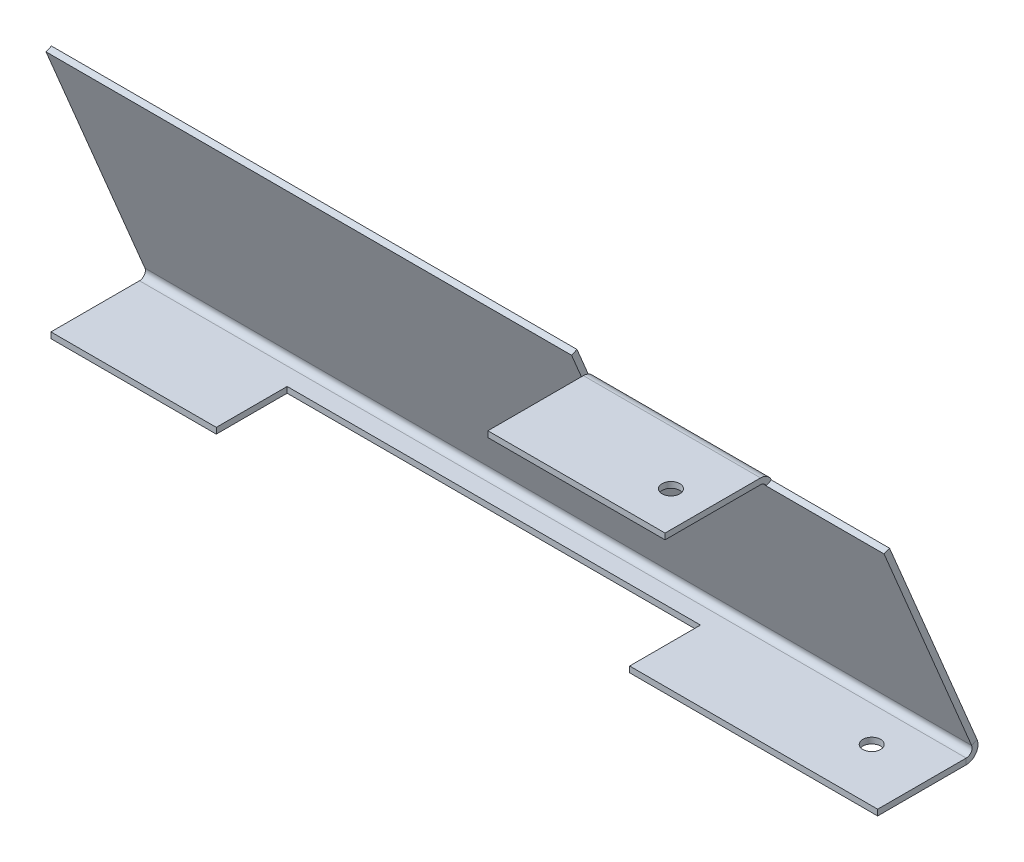
ISO-10303-21;
HEADER;
FILE_DESCRIPTION(('STEP AP214'),'2;1');
FILE_NAME('part.step','',(''),(''),'','','');
FILE_SCHEMA(('AUTOMOTIVE_DESIGN { 1 0 10303 214 1 1 1 1 }'));
ENDSEC;
DATA;
#1=APPLICATION_CONTEXT('core data for automotive mechanical design processes');
#2=APPLICATION_PROTOCOL_DEFINITION('international standard','automotive_design',2000,#1);
#3=PRODUCT_CONTEXT('',#1,'mechanical');
#4=PRODUCT('Part','Part','',(#3));
#5=PRODUCT_RELATED_PRODUCT_CATEGORY('part','',(#4));
#6=PRODUCT_DEFINITION_FORMATION('','',#4);
#7=PRODUCT_DEFINITION_CONTEXT('part definition',#1,'design');
#8=PRODUCT_DEFINITION('design','',#6,#7);
#9=PRODUCT_DEFINITION_SHAPE('','',#8);
#10=(LENGTH_UNIT() NAMED_UNIT(*) SI_UNIT(.MILLI.,.METRE.));
#11=(NAMED_UNIT(*) PLANE_ANGLE_UNIT() SI_UNIT($,.RADIAN.));
#12=(NAMED_UNIT(*) SI_UNIT($,.STERADIAN.) SOLID_ANGLE_UNIT());
#13=UNCERTAINTY_MEASURE_WITH_UNIT(LENGTH_MEASURE(1.E-05),#10,'distance_accuracy_value','');
#14=(GEOMETRIC_REPRESENTATION_CONTEXT(3) GLOBAL_UNCERTAINTY_ASSIGNED_CONTEXT((#13)) GLOBAL_UNIT_ASSIGNED_CONTEXT((#10,
#11,#12)) REPRESENTATION_CONTEXT('',''));
#15=CARTESIAN_POINT('',(0.,0.,0.));
#16=DIRECTION('',(0.,0.,1.));
#17=DIRECTION('',(1.,0.,0.));
#18=AXIS2_PLACEMENT_3D('',#15,#16,#17);
#19=CARTESIAN_POINT('',(-50.,26.1783925873606,26.9352779162392));
#20=DIRECTION('',(1.,0.,0.));
#21=DIRECTION('',(0.,0.,-1.));
#22=AXIS2_PLACEMENT_3D('',#19,#20,#21);
#23=PLANE('',#22);
#24=DIRECTION('',(0.,0.,-1.));
#25=VECTOR('',#24,1.);
#26=CARTESIAN_POINT('',(-50.,39.5,-1.5));
#27=LINE('',#26,#25);
#28=CARTESIAN_POINT('',(-50.,39.5,16.));
#29=VERTEX_POINT('',#28);
#30=CARTESIAN_POINT('',(-50.,39.5,-0.167964071594525));
#31=VERTEX_POINT('',#30);
#32=EDGE_CURVE('E237',#29,#31,#27,.T.);
#33=ORIENTED_EDGE('',*,*,#32,.T.);
#34=DIRECTION('',(0.,-1.,0.));
#35=VECTOR('',#34,1.);
#36=CARTESIAN_POINT('',(-50.,39.5,-0.167964071594525));
#37=LINE('',#36,#35);
#38=CARTESIAN_POINT('',(-50.,38.5,-0.167964071594525));
#39=VERTEX_POINT('',#38);
#40=EDGE_CURVE('E12',#31,#39,#37,.T.);
#41=ORIENTED_EDGE('',*,*,#40,.T.);
#42=DIRECTION('',(0.,0.,-1.));
#43=VECTOR('',#42,1.);
#44=CARTESIAN_POINT('',(-50.,38.5,-1.5));
#45=LINE('',#44,#43);
#46=CARTESIAN_POINT('',(-50.,38.5,16.));
#47=VERTEX_POINT('',#46);
#48=EDGE_CURVE('E62',#47,#39,#45,.T.);
#49=ORIENTED_EDGE('',*,*,#48,.F.);
#50=DIRECTION('',(0.,-1.,0.));
#51=VECTOR('',#50,1.);
#52=CARTESIAN_POINT('',(-50.,38.5,16.));
#53=LINE('',#52,#51);
#54=EDGE_CURVE('E48',#29,#47,#53,.T.);
#55=ORIENTED_EDGE('',*,*,#54,.F.);
#56=EDGE_LOOP('',(#33,#41,#49,#55));
#57=FACE_BOUND('',#56,.T.);
#58=ADVANCED_FACE('F40',(#57),#23,.F.);
#59=CARTESIAN_POINT('',(-140.,0.,0.));
#60=DIRECTION('',(0.,0.,-1.));
#61=DIRECTION('',(-1.,0.,0.));
#62=AXIS2_PLACEMENT_3D('',#59,#60,#61);
#63=PLANE('',#62);
#64=DIRECTION('',(1.,0.,0.));
#65=VECTOR('',#64,1.);
#66=CARTESIAN_POINT('',(-140.,1.,0.));
#67=LINE('',#66,#65);
#68=CARTESIAN_POINT('',(-42.,1.,0.));
#69=VERTEX_POINT('',#68);
#70=CARTESIAN_POINT('',(0.,1.,0.));
#71=VERTEX_POINT('',#70);
#72=EDGE_CURVE('E323',#69,#71,#67,.T.);
#73=ORIENTED_EDGE('',*,*,#72,.F.);
#74=DIRECTION('',(0.,-1.,0.));
#75=VECTOR('',#74,1.);
#76=CARTESIAN_POINT('',(-42.,1.,0.));
#77=LINE('',#76,#75);
#78=CARTESIAN_POINT('',(-42.,0.,0.));
#79=VERTEX_POINT('',#78);
#80=EDGE_CURVE('E254',#69,#79,#77,.T.);
#81=ORIENTED_EDGE('',*,*,#80,.T.);
#82=DIRECTION('',(1.,0.,0.));
#83=VECTOR('',#82,1.);
#84=CARTESIAN_POINT('',(-140.,0.,0.));
#85=LINE('',#84,#83);
#86=CARTESIAN_POINT('',(0.,0.,0.));
#87=VERTEX_POINT('',#86);
#88=EDGE_CURVE('E319',#79,#87,#85,.T.);
#89=ORIENTED_EDGE('',*,*,#88,.T.);
#90=DIRECTION('',(0.,1.,0.));
#91=VECTOR('',#90,1.);
#92=CARTESIAN_POINT('',(0.,0.,0.));
#93=LINE('',#92,#91);
#94=EDGE_CURVE('E292',#87,#71,#93,.T.);
#95=ORIENTED_EDGE('',*,*,#94,.T.);
#96=EDGE_LOOP('',(#73,#81,#89,#95));
#97=FACE_BOUND('',#96,.T.);
#98=ADVANCED_FACE('F421',(#97),#63,.F.);
#99=CARTESIAN_POINT('',(-140.,2.77088917671938,-16.8425399641552));
#100=DIRECTION('',(-1.,0.,0.));
#101=DIRECTION('',(0.,0.,1.));
#102=AXIS2_PLACEMENT_3D('',#99,#100,#101);
#103=PLANE('',#102);
#104=DIRECTION('',(0.,-0.38544458835969,0.922730984255015));
#105=VECTOR('',#104,1.);
#106=CARTESIAN_POINT('',(-140.,2.77088917671938,-16.8425399641552));
#107=LINE('',#106,#105);
#108=CARTESIAN_POINT('',(-140.,2.77088917671938,-16.8425399641552));
#109=VERTEX_POINT('',#108);
#110=CARTESIAN_POINT('',(-140.,2.38544458835969,-15.9198089799002));
#111=VERTEX_POINT('',#110);
#112=EDGE_CURVE('E183',#109,#111,#107,.T.);
#113=ORIENTED_EDGE('',*,*,#112,.F.);
#114=CARTESIAN_POINT('',(-140.,2.,-14.9970779956452));
#115=DIRECTION('',(-1.,0.,0.));
#116=DIRECTION('',(0.,0.,1.));
#117=AXIS2_PLACEMENT_3D('',#114,#115,#116);
#118=CIRCLE('',#117,2.);
#119=CARTESIAN_POINT('',(-140.,0.,-14.9970779956452));
#120=VERTEX_POINT('',#119);
#121=EDGE_CURVE('E279',#120,#109,#118,.F.);
#122=ORIENTED_EDGE('',*,*,#121,.F.);
#123=DIRECTION('',(0.,-1.,0.));
#124=VECTOR('',#123,1.);
#125=CARTESIAN_POINT('',(-140.,1.,-14.9970779956452));
#126=LINE('',#125,#124);
#127=CARTESIAN_POINT('',(-140.,1.,-14.9970779956452));
#128=VERTEX_POINT('',#127);
#129=EDGE_CURVE('E347',#128,#120,#126,.T.);
#130=ORIENTED_EDGE('',*,*,#129,.F.);
#131=CARTESIAN_POINT('',(-140.,2.,-14.9970779956452));
#132=DIRECTION('',(1.,0.,0.));
#133=DIRECTION('',(0.,0.,-1.));
#134=AXIS2_PLACEMENT_3D('',#131,#132,#133);
#135=CIRCLE('',#134,1.);
#136=EDGE_CURVE('E188',#128,#111,#135,.T.);
#137=ORIENTED_EDGE('',*,*,#136,.T.);
#138=EDGE_LOOP('',(#113,#122,#130,#137));
#139=FACE_BOUND('',#138,.T.);
#140=ADVANCED_FACE('F42',(#139),#103,.T.);
#141=CARTESIAN_POINT('',(-140.,1.,-14.9970779956452));
#142=DIRECTION('',(-1.,0.,0.));
#143=DIRECTION('',(0.,0.,1.));
#144=AXIS2_PLACEMENT_3D('',#141,#142,#143);
#145=PLANE('',#144);
#146=DIRECTION('',(0.,0.922730984255015,0.38544458835969));
#147=VECTOR('',#146,1.);
#148=CARTESIAN_POINT('',(-140.,0.,-18.));
#149=LINE('',#148,#147);
#150=CARTESIAN_POINT('',(-140.,42.8845440979945,-0.0862030983061046));
#151=VERTEX_POINT('',#150);
#152=EDGE_CURVE('E282',#109,#151,#149,.T.);
#153=ORIENTED_EDGE('',*,*,#152,.F.);
#154=ORIENTED_EDGE('',*,*,#112,.T.);
#155=DIRECTION('',(0.,0.922730984255015,0.38544458835969));
#156=VECTOR('',#155,1.);
#157=CARTESIAN_POINT('',(-140.,-0.38544458835969,-17.077269015745));
#158=LINE('',#157,#156);
#159=CARTESIAN_POINT('',(-140.,42.4990995096348,0.836527885948911));
#160=VERTEX_POINT('',#159);
#161=EDGE_CURVE('E177',#111,#160,#158,.T.);
#162=ORIENTED_EDGE('',*,*,#161,.T.);
#163=DIRECTION('',(0.,0.38544458835969,-0.922730984255015));
#164=VECTOR('',#163,1.);
#165=CARTESIAN_POINT('',(-140.,42.4990995096348,0.836527885948911));
#166=LINE('',#165,#164);
#167=EDGE_CURVE('E181',#160,#151,#166,.T.);
#168=ORIENTED_EDGE('',*,*,#167,.T.);
#169=EDGE_LOOP('',(#153,#154,#162,#168));
#170=FACE_BOUND('',#169,.T.);
#171=ADVANCED_FACE('F180',(#170),#145,.T.);
#172=CARTESIAN_POINT('',(0.,0.,-14.9970779956452));
#173=DIRECTION('',(1.,0.,0.));
#174=DIRECTION('',(0.,0.,-1.));
#175=AXIS2_PLACEMENT_3D('',#172,#173,#174);
#176=PLANE('',#175);
#177=DIRECTION('',(0.,1.,0.));
#178=VECTOR('',#177,1.);
#179=CARTESIAN_POINT('',(0.,0.,-14.9970779956452));
#180=LINE('',#179,#178);
#181=CARTESIAN_POINT('',(0.,0.,-14.9970779956452));
#182=VERTEX_POINT('',#181);
#183=CARTESIAN_POINT('',(0.,1.,-14.9970779956452));
#184=VERTEX_POINT('',#183);
#185=EDGE_CURVE('E345',#182,#184,#180,.T.);
#186=ORIENTED_EDGE('',*,*,#185,.F.);
#187=CARTESIAN_POINT('',(0.,2.,-14.9970779956452));
#188=DIRECTION('',(-1.,0.,0.));
#189=DIRECTION('',(0.,0.,1.));
#190=AXIS2_PLACEMENT_3D('',#187,#188,#189);
#191=CIRCLE('',#190,2.);
#192=CARTESIAN_POINT('',(0.,2.77088917671938,-16.8425399641552));
#193=VERTEX_POINT('',#192);
#194=EDGE_CURVE('E298',#182,#193,#191,.F.);
#195=ORIENTED_EDGE('',*,*,#194,.T.);
#196=DIRECTION('',(0.,0.38544458835969,-0.922730984255015));
#197=VECTOR('',#196,1.);
#198=CARTESIAN_POINT('',(0.,2.38544458835969,-15.9198089799002));
#199=LINE('',#198,#197);
#200=CARTESIAN_POINT('',(0.,2.38544458835969,-15.9198089799002));
#201=VERTEX_POINT('',#200);
#202=EDGE_CURVE('E343',#201,#193,#199,.T.);
#203=ORIENTED_EDGE('',*,*,#202,.F.);
#204=CARTESIAN_POINT('',(0.,2.,-14.9970779956452));
#205=DIRECTION('',(1.,0.,0.));
#206=DIRECTION('',(0.,0.,-1.));
#207=AXIS2_PLACEMENT_3D('',#204,#205,#206);
#208=CIRCLE('',#207,1.);
#209=EDGE_CURVE('E286',#184,#201,#208,.T.);
#210=ORIENTED_EDGE('',*,*,#209,.F.);
#211=EDGE_LOOP('',(#186,#195,#203,#210));
#212=FACE_BOUND('',#211,.T.);
#213=ADVANCED_FACE('F383',(#212),#176,.T.);
#214=CARTESIAN_POINT('',(0.,2.38544458835969,-15.9198089799002));
#215=DIRECTION('',(1.,0.,0.));
#216=DIRECTION('',(0.,0.,-1.));
#217=AXIS2_PLACEMENT_3D('',#214,#215,#216);
#218=PLANE('',#217);
#219=DIRECTION('',(0.,0.,-1.));
#220=VECTOR('',#219,1.);
#221=CARTESIAN_POINT('',(0.,0.,0.));
#222=LINE('',#221,#220);
#223=EDGE_CURVE('E295',#87,#182,#222,.T.);
#224=ORIENTED_EDGE('',*,*,#223,.T.);
#225=ORIENTED_EDGE('',*,*,#185,.T.);
#226=DIRECTION('',(0.,0.,-1.));
#227=VECTOR('',#226,1.);
#228=CARTESIAN_POINT('',(0.,1.,0.));
#229=LINE('',#228,#227);
#230=EDGE_CURVE('E289',#71,#184,#229,.T.);
#231=ORIENTED_EDGE('',*,*,#230,.F.);
#232=ORIENTED_EDGE('',*,*,#94,.F.);
#233=EDGE_LOOP('',(#224,#225,#231,#232));
#234=FACE_BOUND('',#233,.T.);
#235=ADVANCED_FACE('F482',(#234),#218,.T.);
#236=CARTESIAN_POINT('',(0.,38.5,-0.167964071594525));
#237=DIRECTION('',(1.,0.,0.));
#238=DIRECTION('',(0.,0.,-1.));
#239=AXIS2_PLACEMENT_3D('',#236,#237,#238);
#240=PLANE('',#239);
#241=DIRECTION('',(0.,0.922730984255015,0.38544458835969));
#242=VECTOR('',#241,1.);
#243=CARTESIAN_POINT('',(0.,0.,-18.));
#244=LINE('',#243,#242);
#245=CARTESIAN_POINT('',(0.,38.2708891767194,-2.01342604010455));
#246=VERTEX_POINT('',#245);
#247=EDGE_CURVE('E189',#193,#246,#244,.T.);
#248=ORIENTED_EDGE('',*,*,#247,.T.);
#249=DIRECTION('',(0.,-0.385444588359699,0.922730984255011));
#250=VECTOR('',#249,1.);
#251=CARTESIAN_POINT('',(0.,38.2708891767194,-2.01342604010455));
#252=LINE('',#251,#250);
#253=CARTESIAN_POINT('',(0.,37.8854445883597,-1.09069505584954));
#254=VERTEX_POINT('',#253);
#255=EDGE_CURVE('E306',#246,#254,#252,.T.);
#256=ORIENTED_EDGE('',*,*,#255,.T.);
#257=DIRECTION('',(0.,0.922730984255015,0.38544458835969));
#258=VECTOR('',#257,1.);
#259=CARTESIAN_POINT('',(0.,-0.38544458835969,-17.077269015745));
#260=LINE('',#259,#258);
#261=EDGE_CURVE('E263',#201,#254,#260,.T.);
#262=ORIENTED_EDGE('',*,*,#261,.F.);
#263=ORIENTED_EDGE('',*,*,#202,.T.);
#264=EDGE_LOOP('',(#248,#256,#262,#263));
#265=FACE_BOUND('',#264,.T.);
#266=ADVANCED_FACE('F374',(#265),#240,.T.);
#267=CARTESIAN_POINT('',(-140.,39.5,-1.5));
#268=DIRECTION('',(0.,1.,0.));
#269=DIRECTION('',(0.,0.,1.));
#270=AXIS2_PLACEMENT_3D('',#267,#268,#269);
#271=PLANE('',#270);
#272=CARTESIAN_POINT('',(-26.,39.5,9.));
#273=DIRECTION('',(0.,1.,0.));
#274=DIRECTION('',(0.,0.,1.));
#275=AXIS2_PLACEMENT_3D('',#272,#273,#274);
#276=CIRCLE('',#275,1.5);
#277=CARTESIAN_POINT('',(-26.,39.5,10.5));
#278=VERTEX_POINT('',#277);
#279=EDGE_CURVE('E715',#278,#278,#276,.T.);
#280=ORIENTED_EDGE('',*,*,#279,.F.);
#281=EDGE_LOOP('',(#280));
#282=FACE_BOUND('',#281,.T.);
#283=ORIENTED_EDGE('',*,*,#32,.F.);
#284=DIRECTION('',(1.,0.,0.));
#285=VECTOR('',#284,1.);
#286=CARTESIAN_POINT('',(-140.,39.5,16.));
#287=LINE('',#286,#285);
#288=CARTESIAN_POINT('',(-20.,39.5,16.));
#289=VERTEX_POINT('',#288);
#290=EDGE_CURVE('E284',#29,#289,#287,.T.);
#291=ORIENTED_EDGE('',*,*,#290,.T.);
#292=DIRECTION('',(0.,0.,1.));
#293=VECTOR('',#292,1.);
#294=CARTESIAN_POINT('',(-20.,39.5,-1.5));
#295=LINE('',#294,#293);
#296=CARTESIAN_POINT('',(-20.,39.5,-0.167964071594525));
#297=VERTEX_POINT('',#296);
#298=EDGE_CURVE('E229',#297,#289,#295,.T.);
#299=ORIENTED_EDGE('',*,*,#298,.F.);
#300=DIRECTION('',(1.,0.,0.));
#301=VECTOR('',#300,1.);
#302=CARTESIAN_POINT('',(-140.,39.5,-0.167964071594525));
#303=LINE('',#302,#301);
#304=EDGE_CURVE('E303',#31,#297,#303,.T.);
#305=ORIENTED_EDGE('',*,*,#304,.F.);
#306=EDGE_LOOP('',(#283,#291,#299,#305));
#307=FACE_BOUND('',#306,.T.);
#308=ADVANCED_FACE('F400',(#282,#307),#271,.T.);
#309=CARTESIAN_POINT('',(-140.,37.5,-0.167964071594525));
#310=DIRECTION('',(1.,0.,0.));
#311=DIRECTION('',(0.,0.,-1.));
#312=AXIS2_PLACEMENT_3D('',#309,#310,#311);
#313=CYLINDRICAL_SURFACE('',#312,2.);
#314=CARTESIAN_POINT('',(-50.,37.5,-0.167964071594525));
#315=DIRECTION('',(1.,0.,0.));
#316=DIRECTION('',(0.,0.,-1.));
#317=AXIS2_PLACEMENT_3D('',#314,#315,#316);
#318=CIRCLE('',#317,2.);
#319=CARTESIAN_POINT('',(-50.,38.2708891767194,-2.01342604010455));
#320=VERTEX_POINT('',#319);
#321=EDGE_CURVE('E240',#31,#320,#318,.F.);
#322=ORIENTED_EDGE('',*,*,#321,.F.);
#323=ORIENTED_EDGE('',*,*,#304,.T.);
#324=CARTESIAN_POINT('',(-20.,37.5,-0.167964071594525));
#325=DIRECTION('',(-1.,0.,0.));
#326=DIRECTION('',(0.,0.,1.));
#327=AXIS2_PLACEMENT_3D('',#324,#325,#326);
#328=CIRCLE('',#327,2.);
#329=CARTESIAN_POINT('',(-20.,38.2708891767194,-2.01342604010455));
#330=VERTEX_POINT('',#329);
#331=EDGE_CURVE('E231',#330,#297,#328,.F.);
#332=ORIENTED_EDGE('',*,*,#331,.F.);
#333=DIRECTION('',(1.,0.,0.));
#334=VECTOR('',#333,1.);
#335=CARTESIAN_POINT('',(-140.,38.2708891767194,-2.01342604010455));
#336=LINE('',#335,#334);
#337=EDGE_CURVE('E309',#320,#330,#336,.T.);
#338=ORIENTED_EDGE('',*,*,#337,.F.);
#339=EDGE_LOOP('',(#322,#323,#332,#338));
#340=FACE_BOUND('',#339,.T.);
#341=ADVANCED_FACE('F396',(#340),#313,.T.);
#342=CARTESIAN_POINT('',(-140.,0.,-18.));
#343=DIRECTION('',(0.,0.38544458835969,-0.922730984255015));
#344=DIRECTION('',(0.,0.922730984255015,0.38544458835969));
#345=AXIS2_PLACEMENT_3D('',#342,#343,#344);
#346=PLANE('',#345);
#347=ORIENTED_EDGE('',*,*,#247,.F.);
#348=DIRECTION('',(1.,0.,0.));
#349=VECTOR('',#348,1.);
#350=CARTESIAN_POINT('',(-140.,2.77088917671938,-16.8425399641552));
#351=LINE('',#350,#349);
#352=EDGE_CURVE('E310',#109,#193,#351,.T.);
#353=ORIENTED_EDGE('',*,*,#352,.F.);
#354=ORIENTED_EDGE('',*,*,#152,.T.);
#355=DIRECTION('',(1.,0.,0.));
#356=VECTOR('',#355,1.);
#357=CARTESIAN_POINT('',(-140.,42.8845440979945,-0.0862030983061046));
#358=LINE('',#357,#356);
#359=CARTESIAN_POINT('',(-51.,42.8845440979945,-0.0862030983061098));
#360=VERTEX_POINT('',#359);
#361=EDGE_CURVE('E195',#151,#360,#358,.T.);
#362=ORIENTED_EDGE('',*,*,#361,.T.);
#363=DIRECTION('',(0.,-0.922730984255015,-0.385444588359691));
#364=VECTOR('',#363,1.);
#365=CARTESIAN_POINT('',(-51.,38.2708891767194,-2.01342604010456));
#366=LINE('',#365,#364);
#367=CARTESIAN_POINT('',(-51.,38.2708891767194,-2.01342604010455));
#368=VERTEX_POINT('',#367);
#369=EDGE_CURVE('E55',#360,#368,#366,.T.);
#370=ORIENTED_EDGE('',*,*,#369,.T.);
#371=EDGE_CURVE('E307',#368,#320,#336,.T.);
#372=ORIENTED_EDGE('',*,*,#371,.T.);
#373=ORIENTED_EDGE('',*,*,#337,.T.);
#374=DIRECTION('',(-1.,0.,0.));
#375=VECTOR('',#374,1.);
#376=CARTESIAN_POINT('',(0.,38.2708891767194,-2.01342604010455));
#377=LINE('',#376,#375);
#378=EDGE_CURVE('E214',#246,#330,#377,.T.);
#379=ORIENTED_EDGE('',*,*,#378,.F.);
#380=EDGE_LOOP('',(#347,#353,#354,#362,#370,#372,#373,#379));
#381=FACE_BOUND('',#380,.T.);
#382=ADVANCED_FACE('F390',(#381),#346,.T.);
#383=CARTESIAN_POINT('',(-140.,2.,-14.9970779956452));
#384=DIRECTION('',(1.,0.,0.));
#385=DIRECTION('',(0.,0.,-1.));
#386=AXIS2_PLACEMENT_3D('',#383,#384,#385);
#387=CYLINDRICAL_SURFACE('',#386,2.);
#388=ORIENTED_EDGE('',*,*,#194,.F.);
#389=DIRECTION('',(1.,0.,0.));
#390=VECTOR('',#389,1.);
#391=CARTESIAN_POINT('',(-140.,0.,-14.9970779956452));
#392=LINE('',#391,#390);
#393=EDGE_CURVE('E313',#120,#182,#392,.T.);
#394=ORIENTED_EDGE('',*,*,#393,.F.);
#395=ORIENTED_EDGE('',*,*,#121,.T.);
#396=ORIENTED_EDGE('',*,*,#352,.T.);
#397=EDGE_LOOP('',(#388,#394,#395,#396));
#398=FACE_BOUND('',#397,.T.);
#399=ADVANCED_FACE('F387',(#398),#387,.T.);
#400=CARTESIAN_POINT('',(-140.,0.,0.));
#401=DIRECTION('',(0.,-1.,0.));
#402=DIRECTION('',(0.,0.,-1.));
#403=AXIS2_PLACEMENT_3D('',#400,#401,#402);
#404=PLANE('',#403);
#405=CARTESIAN_POINT('',(-10.,0.,-9.));
#406=DIRECTION('',(0.,1.,0.));
#407=DIRECTION('',(0.,0.,1.));
#408=AXIS2_PLACEMENT_3D('',#405,#406,#407);
#409=CIRCLE('',#408,1.5);
#410=CARTESIAN_POINT('',(-10.,0.,-7.5));
#411=VERTEX_POINT('',#410);
#412=EDGE_CURVE('E210',#411,#411,#409,.T.);
#413=ORIENTED_EDGE('',*,*,#412,.T.);
#414=EDGE_LOOP('',(#413));
#415=FACE_BOUND('',#414,.T.);
#416=DIRECTION('',(0.,0.,1.));
#417=VECTOR('',#416,1.);
#418=CARTESIAN_POINT('',(-42.,0.,-12.));
#419=LINE('',#418,#417);
#420=CARTESIAN_POINT('',(-42.,0.,-12.));
#421=VERTEX_POINT('',#420);
#422=EDGE_CURVE('E243',#421,#79,#419,.T.);
#423=ORIENTED_EDGE('',*,*,#422,.F.);
#424=DIRECTION('',(1.,0.,0.));
#425=VECTOR('',#424,1.);
#426=CARTESIAN_POINT('',(-42.,0.,-12.));
#427=LINE('',#426,#425);
#428=CARTESIAN_POINT('',(-112.,0.,-12.));
#429=VERTEX_POINT('',#428);
#430=EDGE_CURVE('E248',#429,#421,#427,.T.);
#431=ORIENTED_EDGE('',*,*,#430,.F.);
#432=DIRECTION('',(0.,0.,-1.));
#433=VECTOR('',#432,1.);
#434=CARTESIAN_POINT('',(-112.,0.,-12.));
#435=LINE('',#434,#433);
#436=CARTESIAN_POINT('',(-112.,0.,0.));
#437=VERTEX_POINT('',#436);
#438=EDGE_CURVE('E256',#437,#429,#435,.T.);
#439=ORIENTED_EDGE('',*,*,#438,.F.);
#440=CARTESIAN_POINT('',(-140.,0.,0.));
#441=VERTEX_POINT('',#440);
#442=EDGE_CURVE('E316',#441,#437,#85,.T.);
#443=ORIENTED_EDGE('',*,*,#442,.F.);
#444=DIRECTION('',(0.,0.,-1.));
#445=VECTOR('',#444,1.);
#446=CARTESIAN_POINT('',(-140.,0.,0.));
#447=LINE('',#446,#445);
#448=EDGE_CURVE('E276',#441,#120,#447,.T.);
#449=ORIENTED_EDGE('',*,*,#448,.T.);
#450=ORIENTED_EDGE('',*,*,#393,.T.);
#451=ORIENTED_EDGE('',*,*,#223,.F.);
#452=ORIENTED_EDGE('',*,*,#88,.F.);
#453=EDGE_LOOP('',(#423,#431,#439,#443,#449,#450,#451,#452));
#454=FACE_BOUND('',#453,.T.);
#455=ADVANCED_FACE('F456',(#415,#454),#404,.T.);
#456=ORIENTED_EDGE('',*,*,#442,.T.);
#457=DIRECTION('',(0.,-1.,0.));
#458=VECTOR('',#457,1.);
#459=CARTESIAN_POINT('',(-112.,1.,0.));
#460=LINE('',#459,#458);
#461=CARTESIAN_POINT('',(-112.,1.,0.));
#462=VERTEX_POINT('',#461);
#463=EDGE_CURVE('E266',#462,#437,#460,.T.);
#464=ORIENTED_EDGE('',*,*,#463,.F.);
#465=CARTESIAN_POINT('',(-140.,1.,0.));
#466=VERTEX_POINT('',#465);
#467=EDGE_CURVE('E320',#466,#462,#67,.T.);
#468=ORIENTED_EDGE('',*,*,#467,.F.);
#469=DIRECTION('',(0.,1.,0.));
#470=VECTOR('',#469,1.);
#471=CARTESIAN_POINT('',(-140.,0.,0.));
#472=LINE('',#471,#470);
#473=EDGE_CURVE('E274',#441,#466,#472,.T.);
#474=ORIENTED_EDGE('',*,*,#473,.F.);
#475=EDGE_LOOP('',(#456,#464,#468,#474));
#476=FACE_BOUND('',#475,.T.);
#477=ADVANCED_FACE('F427',(#476),#63,.F.);
#478=CARTESIAN_POINT('',(-140.,1.,0.));
#479=DIRECTION('',(0.,-1.,0.));
#480=DIRECTION('',(0.,0.,-1.));
#481=AXIS2_PLACEMENT_3D('',#478,#479,#480);
#482=PLANE('',#481);
#483=CARTESIAN_POINT('',(-10.,1.,-9.));
#484=DIRECTION('',(0.,1.,0.));
#485=DIRECTION('',(0.,0.,1.));
#486=AXIS2_PLACEMENT_3D('',#483,#484,#485);
#487=CIRCLE('',#486,1.5);
#488=CARTESIAN_POINT('',(-10.,1.,-7.5));
#489=VERTEX_POINT('',#488);
#490=EDGE_CURVE('E207',#489,#489,#487,.T.);
#491=ORIENTED_EDGE('',*,*,#490,.F.);
#492=EDGE_LOOP('',(#491));
#493=FACE_BOUND('',#492,.T.);
#494=DIRECTION('',(1.,0.,0.));
#495=VECTOR('',#494,1.);
#496=CARTESIAN_POINT('',(-42.,1.,-12.));
#497=LINE('',#496,#495);
#498=CARTESIAN_POINT('',(-112.,1.,-12.));
#499=VERTEX_POINT('',#498);
#500=CARTESIAN_POINT('',(-42.,1.,-12.));
#501=VERTEX_POINT('',#500);
#502=EDGE_CURVE('E251',#499,#501,#497,.T.);
#503=ORIENTED_EDGE('',*,*,#502,.T.);
#504=DIRECTION('',(0.,0.,1.));
#505=VECTOR('',#504,1.);
#506=CARTESIAN_POINT('',(-42.,1.,-12.));
#507=LINE('',#506,#505);
#508=EDGE_CURVE('E244',#501,#69,#507,.T.);
#509=ORIENTED_EDGE('',*,*,#508,.T.);
#510=ORIENTED_EDGE('',*,*,#72,.T.);
#511=ORIENTED_EDGE('',*,*,#230,.T.);
#512=DIRECTION('',(1.,0.,0.));
#513=VECTOR('',#512,1.);
#514=CARTESIAN_POINT('',(-140.,1.,-14.9970779956452));
#515=LINE('',#514,#513);
#516=EDGE_CURVE('E324',#128,#184,#515,.T.);
#517=ORIENTED_EDGE('',*,*,#516,.F.);
#518=DIRECTION('',(0.,0.,-1.));
#519=VECTOR('',#518,1.);
#520=CARTESIAN_POINT('',(-140.,1.,0.));
#521=LINE('',#520,#519);
#522=EDGE_CURVE('E271',#466,#128,#521,.T.);
#523=ORIENTED_EDGE('',*,*,#522,.F.);
#524=ORIENTED_EDGE('',*,*,#467,.T.);
#525=DIRECTION('',(0.,0.,-1.));
#526=VECTOR('',#525,1.);
#527=CARTESIAN_POINT('',(-112.,1.,-12.));
#528=LINE('',#527,#526);
#529=EDGE_CURVE('E247',#462,#499,#528,.T.);
#530=ORIENTED_EDGE('',*,*,#529,.T.);
#531=EDGE_LOOP('',(#503,#509,#510,#511,#517,#523,#524,#530));
#532=FACE_BOUND('',#531,.T.);
#533=ADVANCED_FACE('F461',(#493,#532),#482,.F.);
#534=CARTESIAN_POINT('',(-140.,2.,-14.9970779956452));
#535=DIRECTION('',(1.,0.,0.));
#536=DIRECTION('',(0.,0.,-1.));
#537=AXIS2_PLACEMENT_3D('',#534,#535,#536);
#538=CYLINDRICAL_SURFACE('',#537,1.);
#539=ORIENTED_EDGE('',*,*,#209,.T.);
#540=DIRECTION('',(1.,0.,0.));
#541=VECTOR('',#540,1.);
#542=CARTESIAN_POINT('',(-140.,2.38544458835969,-15.9198089799002));
#543=LINE('',#542,#541);
#544=EDGE_CURVE('E327',#111,#201,#543,.T.);
#545=ORIENTED_EDGE('',*,*,#544,.F.);
#546=ORIENTED_EDGE('',*,*,#136,.F.);
#547=ORIENTED_EDGE('',*,*,#516,.T.);
#548=EDGE_LOOP('',(#539,#545,#546,#547));
#549=FACE_BOUND('',#548,.T.);
#550=ADVANCED_FACE('F379',(#549),#538,.F.);
#551=CARTESIAN_POINT('',(-140.,-0.38544458835969,-17.077269015745));
#552=DIRECTION('',(0.,0.38544458835969,-0.922730984255015));
#553=DIRECTION('',(0.,0.922730984255015,0.38544458835969));
#554=AXIS2_PLACEMENT_3D('',#551,#552,#553);
#555=PLANE('',#554);
#556=ORIENTED_EDGE('',*,*,#261,.T.);
#557=DIRECTION('',(1.,0.,0.));
#558=VECTOR('',#557,1.);
#559=CARTESIAN_POINT('',(-140.,37.8854445883597,-1.09069505584954));
#560=LINE('',#559,#558);
#561=CARTESIAN_POINT('',(-20.,37.8854445883597,-1.09069505584954));
#562=VERTEX_POINT('',#561);
#563=EDGE_CURVE('E332',#562,#254,#560,.T.);
#564=ORIENTED_EDGE('',*,*,#563,.F.);
#565=CARTESIAN_POINT('',(-50.,37.8854445883597,-1.09069505584954));
#566=VERTEX_POINT('',#565);
#567=EDGE_CURVE('E331',#566,#562,#560,.T.);
#568=ORIENTED_EDGE('',*,*,#567,.F.);
#569=CARTESIAN_POINT('',(-51.,37.8854445883597,-1.09069505584954));
#570=VERTEX_POINT('',#569);
#571=EDGE_CURVE('E329',#570,#566,#560,.T.);
#572=ORIENTED_EDGE('',*,*,#571,.F.);
#573=DIRECTION('',(0.,-0.922730984255015,-0.385444588359691));
#574=VECTOR('',#573,1.);
#575=CARTESIAN_POINT('',(-51.,37.8854445883597,-1.09069505584954));
#576=LINE('',#575,#574);
#577=CARTESIAN_POINT('',(-51.,42.4990995096348,0.836527885948905));
#578=VERTEX_POINT('',#577);
#579=EDGE_CURVE('E197',#578,#570,#576,.T.);
#580=ORIENTED_EDGE('',*,*,#579,.F.);
#581=DIRECTION('',(1.,0.,0.));
#582=VECTOR('',#581,1.);
#583=CARTESIAN_POINT('',(-140.,42.4990995096348,0.836527885948911));
#584=LINE('',#583,#582);
#585=EDGE_CURVE('E194',#160,#578,#584,.T.);
#586=ORIENTED_EDGE('',*,*,#585,.F.);
#587=ORIENTED_EDGE('',*,*,#161,.F.);
#588=ORIENTED_EDGE('',*,*,#544,.T.);
#589=EDGE_LOOP('',(#556,#564,#568,#572,#580,#586,#587,#588));
#590=FACE_BOUND('',#589,.T.);
#591=ADVANCED_FACE('F201',(#590),#555,.F.);
#592=CARTESIAN_POINT('',(-140.,37.5,-0.167964071594525));
#593=DIRECTION('',(1.,0.,0.));
#594=DIRECTION('',(0.,0.,-1.));
#595=AXIS2_PLACEMENT_3D('',#592,#593,#594);
#596=CYLINDRICAL_SURFACE('',#595,1.);
#597=DIRECTION('',(1.,0.,0.));
#598=VECTOR('',#597,1.);
#599=CARTESIAN_POINT('',(-140.,38.5,-0.167964071594525));
#600=LINE('',#599,#598);
#601=CARTESIAN_POINT('',(-20.,38.5,-0.167964071594525));
#602=VERTEX_POINT('',#601);
#603=EDGE_CURVE('E333',#39,#602,#600,.T.);
#604=ORIENTED_EDGE('',*,*,#603,.F.);
#605=CARTESIAN_POINT('',(-50.,37.5,-0.167964071594525));
#606=DIRECTION('',(1.,0.,0.));
#607=DIRECTION('',(0.,0.,-1.));
#608=AXIS2_PLACEMENT_3D('',#605,#606,#607);
#609=CIRCLE('',#608,1.);
#610=EDGE_CURVE('E234',#39,#566,#609,.F.);
#611=ORIENTED_EDGE('',*,*,#610,.T.);
#612=ORIENTED_EDGE('',*,*,#567,.T.);
#613=CARTESIAN_POINT('',(-20.,37.5,-0.167964071594525));
#614=DIRECTION('',(-1.,0.,0.));
#615=DIRECTION('',(0.,0.,1.));
#616=AXIS2_PLACEMENT_3D('',#613,#614,#615);
#617=CIRCLE('',#616,1.);
#618=EDGE_CURVE('E226',#562,#602,#617,.F.);
#619=ORIENTED_EDGE('',*,*,#618,.T.);
#620=EDGE_LOOP('',(#604,#611,#612,#619));
#621=FACE_BOUND('',#620,.T.);
#622=ADVANCED_FACE('F365',(#621),#596,.F.);
#623=CARTESIAN_POINT('',(-140.,38.5,-1.5));
#624=DIRECTION('',(0.,1.,0.));
#625=DIRECTION('',(0.,0.,1.));
#626=AXIS2_PLACEMENT_3D('',#623,#624,#625);
#627=PLANE('',#626);
#628=CARTESIAN_POINT('',(-26.,38.5,9.));
#629=DIRECTION('',(0.,1.,0.));
#630=DIRECTION('',(0.,0.,1.));
#631=AXIS2_PLACEMENT_3D('',#628,#629,#630);
#632=CIRCLE('',#631,1.5);
#633=CARTESIAN_POINT('',(-26.,38.5,10.5));
#634=VERTEX_POINT('',#633);
#635=EDGE_CURVE('E712',#634,#634,#632,.T.);
#636=ORIENTED_EDGE('',*,*,#635,.T.);
#637=EDGE_LOOP('',(#636));
#638=FACE_BOUND('',#637,.T.);
#639=DIRECTION('',(1.,0.,0.));
#640=VECTOR('',#639,1.);
#641=CARTESIAN_POINT('',(-140.,38.5,16.));
#642=LINE('',#641,#640);
#643=CARTESIAN_POINT('',(-20.,38.5,16.));
#644=VERTEX_POINT('',#643);
#645=EDGE_CURVE('E336',#47,#644,#642,.T.);
#646=ORIENTED_EDGE('',*,*,#645,.F.);
#647=ORIENTED_EDGE('',*,*,#48,.T.);
#648=ORIENTED_EDGE('',*,*,#603,.T.);
#649=DIRECTION('',(0.,0.,1.));
#650=VECTOR('',#649,1.);
#651=CARTESIAN_POINT('',(-20.,38.5,-1.5));
#652=LINE('',#651,#650);
#653=EDGE_CURVE('E219',#602,#644,#652,.T.);
#654=ORIENTED_EDGE('',*,*,#653,.T.);
#655=EDGE_LOOP('',(#646,#647,#648,#654));
#656=FACE_BOUND('',#655,.T.);
#657=ADVANCED_FACE('F358',(#638,#656),#627,.F.);
#658=CARTESIAN_POINT('',(-140.,38.5,16.));
#659=DIRECTION('',(0.,0.,-1.));
#660=DIRECTION('',(-1.,0.,0.));
#661=AXIS2_PLACEMENT_3D('',#658,#659,#660);
#662=PLANE('',#661);
#663=ORIENTED_EDGE('',*,*,#290,.F.);
#664=ORIENTED_EDGE('',*,*,#54,.T.);
#665=ORIENTED_EDGE('',*,*,#645,.T.);
#666=DIRECTION('',(0.,1.,0.));
#667=VECTOR('',#666,1.);
#668=CARTESIAN_POINT('',(-20.,38.5,16.));
#669=LINE('',#668,#667);
#670=EDGE_CURVE('E350',#644,#289,#669,.T.);
#671=ORIENTED_EDGE('',*,*,#670,.T.);
#672=EDGE_LOOP('',(#663,#664,#665,#671));
#673=FACE_BOUND('',#672,.T.);
#674=ADVANCED_FACE('F355',(#673),#662,.F.);
#675=CARTESIAN_POINT('',(-140.,37.5,-0.167964071594525));
#676=DIRECTION('',(1.,0.,0.));
#677=DIRECTION('',(0.,0.,-1.));
#678=AXIS2_PLACEMENT_3D('',#675,#676,#677);
#679=PLANE('',#678);
#680=ORIENTED_EDGE('',*,*,#522,.T.);
#681=ORIENTED_EDGE('',*,*,#129,.T.);
#682=ORIENTED_EDGE('',*,*,#448,.F.);
#683=ORIENTED_EDGE('',*,*,#473,.T.);
#684=EDGE_LOOP('',(#680,#681,#682,#683));
#685=FACE_BOUND('',#684,.T.);
#686=ADVANCED_FACE('F445',(#685),#679,.F.);
#687=CARTESIAN_POINT('',(-42.,1.,-12.));
#688=DIRECTION('',(1.,0.,0.));
#689=DIRECTION('',(0.,0.,-1.));
#690=AXIS2_PLACEMENT_3D('',#687,#688,#689);
#691=PLANE('',#690);
#692=ORIENTED_EDGE('',*,*,#422,.T.);
#693=ORIENTED_EDGE('',*,*,#80,.F.);
#694=ORIENTED_EDGE('',*,*,#508,.F.);
#695=DIRECTION('',(0.,-1.,0.));
#696=VECTOR('',#695,1.);
#697=CARTESIAN_POINT('',(-42.,1.,-12.));
#698=LINE('',#697,#696);
#699=EDGE_CURVE('E261',#501,#421,#698,.T.);
#700=ORIENTED_EDGE('',*,*,#699,.T.);
#701=EDGE_LOOP('',(#692,#693,#694,#700));
#702=FACE_BOUND('',#701,.T.);
#703=ADVANCED_FACE('F438',(#702),#691,.F.);
#704=CARTESIAN_POINT('',(-42.,1.,-12.));
#705=DIRECTION('',(0.,0.,-1.));
#706=DIRECTION('',(-1.,0.,0.));
#707=AXIS2_PLACEMENT_3D('',#704,#705,#706);
#708=PLANE('',#707);
#709=ORIENTED_EDGE('',*,*,#430,.T.);
#710=ORIENTED_EDGE('',*,*,#699,.F.);
#711=ORIENTED_EDGE('',*,*,#502,.F.);
#712=DIRECTION('',(0.,-1.,0.));
#713=VECTOR('',#712,1.);
#714=CARTESIAN_POINT('',(-112.,1.,-12.));
#715=LINE('',#714,#713);
#716=EDGE_CURVE('E264',#499,#429,#715,.T.);
#717=ORIENTED_EDGE('',*,*,#716,.T.);
#718=EDGE_LOOP('',(#709,#710,#711,#717));
#719=FACE_BOUND('',#718,.T.);
#720=ADVANCED_FACE('F435',(#719),#708,.F.);
#721=CARTESIAN_POINT('',(-112.,1.,-12.));
#722=DIRECTION('',(-1.,0.,0.));
#723=DIRECTION('',(0.,0.,1.));
#724=AXIS2_PLACEMENT_3D('',#721,#722,#723);
#725=PLANE('',#724);
#726=ORIENTED_EDGE('',*,*,#438,.T.);
#727=ORIENTED_EDGE('',*,*,#716,.F.);
#728=ORIENTED_EDGE('',*,*,#529,.F.);
#729=ORIENTED_EDGE('',*,*,#463,.T.);
#730=EDGE_LOOP('',(#726,#727,#728,#729));
#731=FACE_BOUND('',#730,.T.);
#732=ADVANCED_FACE('F434',(#731),#725,.F.);
#733=CARTESIAN_POINT('',(0.,26.1783925873606,26.9352779162392));
#734=DIRECTION('',(0.,-0.922730984255015,-0.38544458835969));
#735=DIRECTION('',(0.,0.38544458835969,-0.922730984255015));
#736=AXIS2_PLACEMENT_3D('',#733,#734,#735);
#737=PLANE('',#736);
#738=ORIENTED_EDGE('',*,*,#255,.F.);
#739=ORIENTED_EDGE('',*,*,#378,.T.);
#740=DIRECTION('',(0.,0.38544458835969,-0.922730984255015));
#741=VECTOR('',#740,1.);
#742=CARTESIAN_POINT('',(-20.,26.1783925873606,26.9352779162392));
#743=LINE('',#742,#741);
#744=EDGE_CURVE('E220',#562,#330,#743,.T.);
#745=ORIENTED_EDGE('',*,*,#744,.F.);
#746=ORIENTED_EDGE('',*,*,#563,.T.);
#747=EDGE_LOOP('',(#738,#739,#745,#746));
#748=FACE_BOUND('',#747,.T.);
#749=ADVANCED_FACE('F370',(#748),#737,.F.);
#750=CARTESIAN_POINT('',(-20.,26.1783925873606,26.9352779162392));
#751=DIRECTION('',(-1.,0.,0.));
#752=DIRECTION('',(0.,0.,1.));
#753=AXIS2_PLACEMENT_3D('',#750,#751,#752);
#754=PLANE('',#753);
#755=ORIENTED_EDGE('',*,*,#331,.T.);
#756=ORIENTED_EDGE('',*,*,#298,.T.);
#757=ORIENTED_EDGE('',*,*,#670,.F.);
#758=ORIENTED_EDGE('',*,*,#653,.F.);
#759=ORIENTED_EDGE('',*,*,#618,.F.);
#760=ORIENTED_EDGE('',*,*,#744,.T.);
#761=EDGE_LOOP('',(#755,#756,#757,#758,#759,#760));
#762=FACE_BOUND('',#761,.T.);
#763=ADVANCED_FACE('F361',(#762),#754,.F.);
#764=CARTESIAN_POINT('',(-50.,26.1783925873606,26.9352779162392));
#765=DIRECTION('',(0.,-0.922730984255015,-0.38544458835969));
#766=DIRECTION('',(0.,0.38544458835969,-0.922730984255015));
#767=AXIS2_PLACEMENT_3D('',#764,#765,#766);
#768=PLANE('',#767);
#769=ORIENTED_EDGE('',*,*,#371,.F.);
#770=DIRECTION('',(0.,0.38544458835969,-0.922730984255015));
#771=VECTOR('',#770,1.);
#772=CARTESIAN_POINT('',(-51.,37.8854445883597,-1.09069505584954));
#773=LINE('',#772,#771);
#774=EDGE_CURVE('E212',#570,#368,#773,.T.);
#775=ORIENTED_EDGE('',*,*,#774,.F.);
#776=ORIENTED_EDGE('',*,*,#571,.T.);
#777=DIRECTION('',(0.,0.38544458835969,-0.922730984255015));
#778=VECTOR('',#777,1.);
#779=CARTESIAN_POINT('',(-50.,26.1783925873606,26.9352779162392));
#780=LINE('',#779,#778);
#781=EDGE_CURVE('E216',#566,#320,#780,.T.);
#782=ORIENTED_EDGE('',*,*,#781,.T.);
#783=EDGE_LOOP('',(#769,#775,#776,#782));
#784=FACE_BOUND('',#783,.T.);
#785=ADVANCED_FACE('F406',(#784),#768,.F.);
#786=ORIENTED_EDGE('',*,*,#40,.F.);
#787=ORIENTED_EDGE('',*,*,#321,.T.);
#788=ORIENTED_EDGE('',*,*,#781,.F.);
#789=ORIENTED_EDGE('',*,*,#610,.F.);
#790=EDGE_LOOP('',(#786,#787,#788,#789));
#791=FACE_BOUND('',#790,.T.);
#792=ADVANCED_FACE('F403',(#791),#23,.F.);
#793=CARTESIAN_POINT('',(-51.,37.8854445883597,-1.09069505584954));
#794=DIRECTION('',(1.,0.,0.));
#795=DIRECTION('',(0.,0.,-1.));
#796=AXIS2_PLACEMENT_3D('',#793,#794,#795);
#797=PLANE('',#796);
#798=ORIENTED_EDGE('',*,*,#369,.F.);
#799=DIRECTION('',(0.,0.38544458835969,-0.922730984255015));
#800=VECTOR('',#799,1.);
#801=CARTESIAN_POINT('',(-51.,42.4990995096348,0.836527885948905));
#802=LINE('',#801,#800);
#803=EDGE_CURVE('E196',#578,#360,#802,.T.);
#804=ORIENTED_EDGE('',*,*,#803,.F.);
#805=ORIENTED_EDGE('',*,*,#579,.T.);
#806=ORIENTED_EDGE('',*,*,#774,.T.);
#807=EDGE_LOOP('',(#798,#804,#805,#806));
#808=FACE_BOUND('',#807,.T.);
#809=ADVANCED_FACE('F409',(#808),#797,.T.);
#810=CARTESIAN_POINT('',(-140.,42.4990995096348,0.836527885948911));
#811=DIRECTION('',(0.,0.922730984255015,0.38544458835969));
#812=DIRECTION('',(0.,-0.38544458835969,0.922730984255015));
#813=AXIS2_PLACEMENT_3D('',#810,#811,#812);
#814=PLANE('',#813);
#815=ORIENTED_EDGE('',*,*,#361,.F.);
#816=ORIENTED_EDGE('',*,*,#167,.F.);
#817=ORIENTED_EDGE('',*,*,#585,.T.);
#818=ORIENTED_EDGE('',*,*,#803,.T.);
#819=EDGE_LOOP('',(#815,#816,#817,#818));
#820=FACE_BOUND('',#819,.T.);
#821=ADVANCED_FACE('F193',(#820),#814,.T.);
#822=CARTESIAN_POINT('',(-10.,0.,-9.));
#823=DIRECTION('',(0.,1.,0.));
#824=DIRECTION('',(0.,0.,1.));
#825=AXIS2_PLACEMENT_3D('',#822,#823,#824);
#826=CYLINDRICAL_SURFACE('',#825,1.5);
#827=ORIENTED_EDGE('',*,*,#412,.F.);
#828=EDGE_LOOP('',(#827));
#829=FACE_BOUND('',#828,.T.);
#830=ORIENTED_EDGE('',*,*,#490,.T.);
#831=EDGE_LOOP('',(#830));
#832=FACE_BOUND('',#831,.T.);
#833=ADVANCED_FACE('F416',(#829,#832),#826,.F.);
#834=CARTESIAN_POINT('',(-26.,38.5,9.));
#835=DIRECTION('',(0.,1.,0.));
#836=DIRECTION('',(0.,0.,1.));
#837=AXIS2_PLACEMENT_3D('',#834,#835,#836);
#838=CYLINDRICAL_SURFACE('',#837,1.5);
#839=ORIENTED_EDGE('',*,*,#635,.F.);
#840=EDGE_LOOP('',(#839));
#841=FACE_BOUND('',#840,.T.);
#842=ORIENTED_EDGE('',*,*,#279,.T.);
#843=EDGE_LOOP('',(#842));
#844=FACE_BOUND('',#843,.T.);
#845=ADVANCED_FACE('F670',(#841,#844),#838,.F.);
#846=CLOSED_SHELL('',(#58,#98,#140,#171,#213,#235,#266,#308,#341,#382,#399,#455,#477,#533,#550,
#591,#622,#657,#674,#686,#703,#720,#732,#749,#763,#785,#792,#809,#821,#833,#845));
#847=MANIFOLD_SOLID_BREP('B2',#846);
#848=ADVANCED_BREP_SHAPE_REPRESENTATION('',(#18,#847),#14);
#849=SHAPE_DEFINITION_REPRESENTATION(#9,#848);
ENDSEC;
END-ISO-10303-21;
